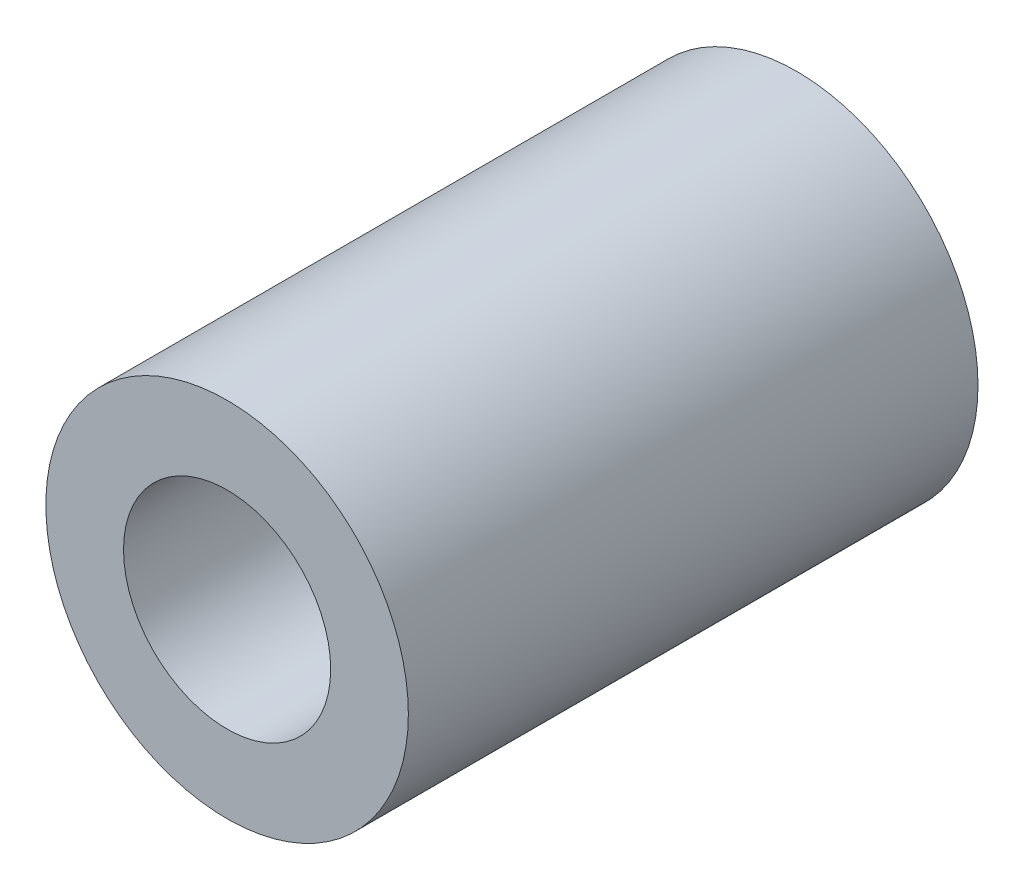
ISO-10303-21;
HEADER;
FILE_DESCRIPTION(('STEP AP214'),'2;1');
FILE_NAME('part.step','',(''),(''),'','','');
FILE_SCHEMA(('AUTOMOTIVE_DESIGN { 1 0 10303 214 1 1 1 1 }'));
ENDSEC;
DATA;
#1=APPLICATION_CONTEXT('core data for automotive mechanical design processes');
#2=APPLICATION_PROTOCOL_DEFINITION('international standard','automotive_design',2000,#1);
#3=PRODUCT_CONTEXT('',#1,'mechanical');
#4=PRODUCT('Part','Part','',(#3));
#5=PRODUCT_RELATED_PRODUCT_CATEGORY('part','',(#4));
#6=PRODUCT_DEFINITION_FORMATION('','',#4);
#7=PRODUCT_DEFINITION_CONTEXT('part definition',#1,'design');
#8=PRODUCT_DEFINITION('design','',#6,#7);
#9=PRODUCT_DEFINITION_SHAPE('','',#8);
#10=(LENGTH_UNIT() NAMED_UNIT(*) SI_UNIT(.MILLI.,.METRE.));
#11=(NAMED_UNIT(*) PLANE_ANGLE_UNIT() SI_UNIT($,.RADIAN.));
#12=(NAMED_UNIT(*) SI_UNIT($,.STERADIAN.) SOLID_ANGLE_UNIT());
#13=UNCERTAINTY_MEASURE_WITH_UNIT(LENGTH_MEASURE(1.E-05),#10,'distance_accuracy_value','');
#14=(GEOMETRIC_REPRESENTATION_CONTEXT(3) GLOBAL_UNCERTAINTY_ASSIGNED_CONTEXT((#13)) GLOBAL_UNIT_ASSIGNED_CONTEXT((#10,
#11,#12)) REPRESENTATION_CONTEXT('',''));
#15=CARTESIAN_POINT('',(0.,0.,0.));
#16=DIRECTION('',(0.,0.,1.));
#17=DIRECTION('',(1.,0.,0.));
#18=AXIS2_PLACEMENT_3D('',#15,#16,#17);
#19=CARTESIAN_POINT('',(0.,0.,11.));
#20=DIRECTION('',(0.,0.,1.));
#21=DIRECTION('',(1.,0.,0.));
#22=AXIS2_PLACEMENT_3D('',#19,#20,#21);
#23=PLANE('',#22);
#24=CARTESIAN_POINT('',(0.,0.,11.));
#25=DIRECTION('',(0.,0.,1.));
#26=DIRECTION('',(1.,0.,0.));
#27=AXIS2_PLACEMENT_3D('',#24,#25,#26);
#28=CIRCLE('',#27,3.5);
#29=CARTESIAN_POINT('',(3.5,0.,11.));
#30=VERTEX_POINT('',#29);
#31=EDGE_CURVE('E10',#30,#30,#28,.T.);
#32=ORIENTED_EDGE('',*,*,#31,.T.);
#33=EDGE_LOOP('',(#32));
#34=FACE_BOUND('',#33,.T.);
#35=CARTESIAN_POINT('',(0.,0.,11.));
#36=DIRECTION('',(0.,0.,1.));
#37=DIRECTION('',(1.,0.,0.));
#38=AXIS2_PLACEMENT_3D('',#35,#36,#37);
#39=CIRCLE('',#38,2.);
#40=CARTESIAN_POINT('',(2.,0.,11.));
#41=VERTEX_POINT('',#40);
#42=EDGE_CURVE('E45',#41,#41,#39,.T.);
#43=ORIENTED_EDGE('',*,*,#42,.F.);
#44=EDGE_LOOP('',(#43));
#45=FACE_BOUND('',#44,.T.);
#46=ADVANCED_FACE('F34',(#34,#45),#23,.T.);
#47=CARTESIAN_POINT('',(0.,0.,0.));
#48=DIRECTION('',(0.,0.,1.));
#49=DIRECTION('',(1.,0.,0.));
#50=AXIS2_PLACEMENT_3D('',#47,#48,#49);
#51=PLANE('',#50);
#52=CARTESIAN_POINT('',(0.,0.,0.));
#53=DIRECTION('',(0.,0.,1.));
#54=DIRECTION('',(1.,0.,0.));
#55=AXIS2_PLACEMENT_3D('',#52,#53,#54);
#56=CIRCLE('',#55,3.5);
#57=CARTESIAN_POINT('',(3.5,0.,0.));
#58=VERTEX_POINT('',#57);
#59=EDGE_CURVE('E38',#58,#58,#56,.T.);
#60=ORIENTED_EDGE('',*,*,#59,.F.);
#61=EDGE_LOOP('',(#60));
#62=FACE_BOUND('',#61,.T.);
#63=CARTESIAN_POINT('',(0.,0.,0.));
#64=DIRECTION('',(0.,0.,1.));
#65=DIRECTION('',(1.,0.,0.));
#66=AXIS2_PLACEMENT_3D('',#63,#64,#65);
#67=CIRCLE('',#66,2.);
#68=CARTESIAN_POINT('',(2.,0.,0.));
#69=VERTEX_POINT('',#68);
#70=EDGE_CURVE('E47',#69,#69,#67,.T.);
#71=ORIENTED_EDGE('',*,*,#70,.T.);
#72=EDGE_LOOP('',(#71));
#73=FACE_BOUND('',#72,.T.);
#74=ADVANCED_FACE('F57',(#62,#73),#51,.F.);
#75=CARTESIAN_POINT('',(0.,0.,11.));
#76=DIRECTION('',(0.,0.,-1.));
#77=DIRECTION('',(-1.,0.,0.));
#78=AXIS2_PLACEMENT_3D('',#75,#76,#77);
#79=CYLINDRICAL_SURFACE('',#78,3.5);
#80=ORIENTED_EDGE('',*,*,#31,.F.);
#81=EDGE_LOOP('',(#80));
#82=FACE_BOUND('',#81,.T.);
#83=ORIENTED_EDGE('',*,*,#59,.T.);
#84=EDGE_LOOP('',(#83));
#85=FACE_BOUND('',#84,.T.);
#86=ADVANCED_FACE('F36',(#82,#85),#79,.T.);
#87=CARTESIAN_POINT('',(0.,0.,11.));
#88=DIRECTION('',(0.,0.,-1.));
#89=DIRECTION('',(-1.,0.,0.));
#90=AXIS2_PLACEMENT_3D('',#87,#88,#89);
#91=CYLINDRICAL_SURFACE('',#90,2.);
#92=ORIENTED_EDGE('',*,*,#42,.T.);
#93=EDGE_LOOP('',(#92));
#94=FACE_BOUND('',#93,.T.);
#95=ORIENTED_EDGE('',*,*,#70,.F.);
#96=EDGE_LOOP('',(#95));
#97=FACE_BOUND('',#96,.T.);
#98=ADVANCED_FACE('F53',(#94,#97),#91,.F.);
#99=CLOSED_SHELL('',(#46,#74,#86,#98));
#100=MANIFOLD_SOLID_BREP('B2',#99);
#101=ADVANCED_BREP_SHAPE_REPRESENTATION('',(#18,#100),#14);
#102=SHAPE_DEFINITION_REPRESENTATION(#9,#101);
ENDSEC;
END-ISO-10303-21;
